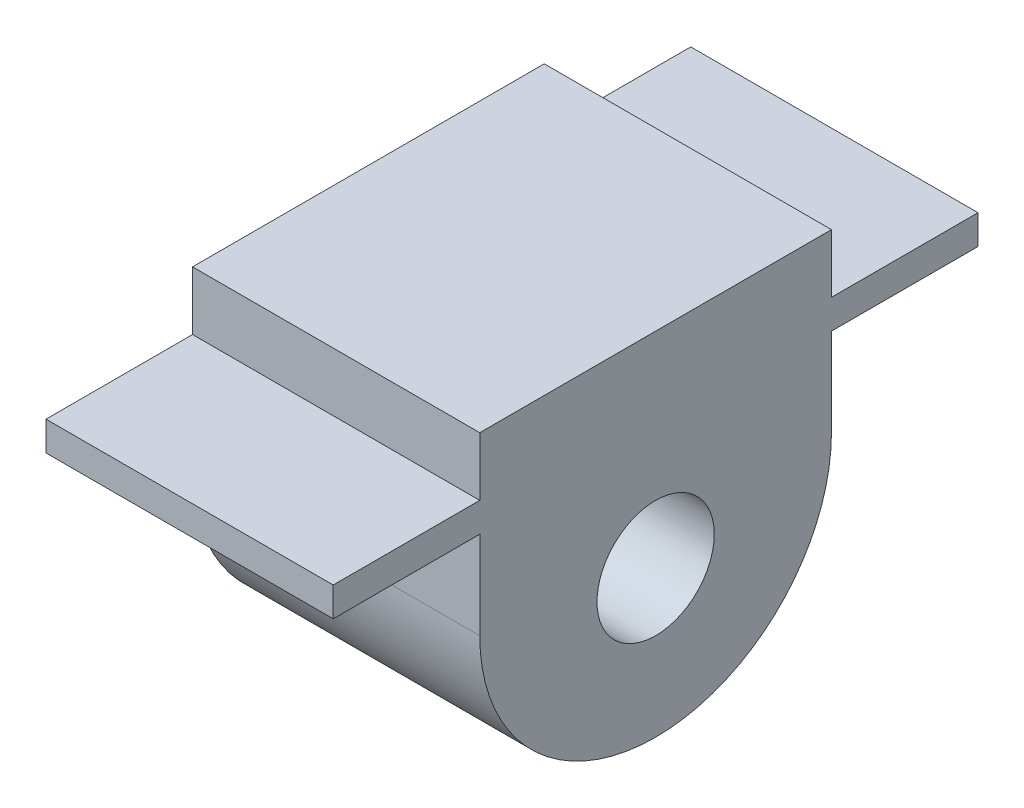
ISO-10303-21;
HEADER;
FILE_DESCRIPTION(('STEP AP214'),'2;1');
FILE_NAME('part.step','',(''),(''),'','','');
FILE_SCHEMA(('AUTOMOTIVE_DESIGN { 1 0 10303 214 1 1 1 1 }'));
ENDSEC;
DATA;
#1=APPLICATION_CONTEXT('core data for automotive mechanical design processes');
#2=APPLICATION_PROTOCOL_DEFINITION('international standard','automotive_design',2000,#1);
#3=PRODUCT_CONTEXT('',#1,'mechanical');
#4=PRODUCT('Part','Part','',(#3));
#5=PRODUCT_RELATED_PRODUCT_CATEGORY('part','',(#4));
#6=PRODUCT_DEFINITION_FORMATION('','',#4);
#7=PRODUCT_DEFINITION_CONTEXT('part definition',#1,'design');
#8=PRODUCT_DEFINITION('design','',#6,#7);
#9=PRODUCT_DEFINITION_SHAPE('','',#8);
#10=(LENGTH_UNIT() NAMED_UNIT(*) SI_UNIT(.MILLI.,.METRE.));
#11=(NAMED_UNIT(*) PLANE_ANGLE_UNIT() SI_UNIT($,.RADIAN.));
#12=(NAMED_UNIT(*) SI_UNIT($,.STERADIAN.) SOLID_ANGLE_UNIT());
#13=UNCERTAINTY_MEASURE_WITH_UNIT(LENGTH_MEASURE(1.E-05),#10,'distance_accuracy_value','');
#14=(GEOMETRIC_REPRESENTATION_CONTEXT(3) GLOBAL_UNCERTAINTY_ASSIGNED_CONTEXT((#13)) GLOBAL_UNIT_ASSIGNED_CONTEXT((#10,
#11,#12)) REPRESENTATION_CONTEXT('',''));
#15=CARTESIAN_POINT('',(0.,0.,0.));
#16=DIRECTION('',(0.,0.,1.));
#17=DIRECTION('',(1.,0.,0.));
#18=AXIS2_PLACEMENT_3D('',#15,#16,#17);
#19=CARTESIAN_POINT('',(-4.9,-10.,6.));
#20=DIRECTION('',(0.,0.,-1.));
#21=DIRECTION('',(-1.,0.,0.));
#22=AXIS2_PLACEMENT_3D('',#19,#20,#21);
#23=PLANE('',#22);
#24=DIRECTION('',(0.,1.,0.));
#25=VECTOR('',#24,1.);
#26=CARTESIAN_POINT('',(-4.9,-10.,6.));
#27=LINE('',#26,#25);
#28=CARTESIAN_POINT('',(-4.9,0.,6.));
#29=VERTEX_POINT('',#28);
#30=CARTESIAN_POINT('',(-4.9,2.,6.));
#31=VERTEX_POINT('',#30);
#32=EDGE_CURVE('E258',#29,#31,#27,.T.);
#33=ORIENTED_EDGE('',*,*,#32,.F.);
#34=DIRECTION('',(1.,0.,0.));
#35=VECTOR('',#34,1.);
#36=CARTESIAN_POINT('',(4.9,0.,6.));
#37=LINE('',#36,#35);
#38=CARTESIAN_POINT('',(4.9,0.,6.));
#39=VERTEX_POINT('',#38);
#40=EDGE_CURVE('E97',#29,#39,#37,.T.);
#41=ORIENTED_EDGE('',*,*,#40,.T.);
#42=DIRECTION('',(0.,1.,0.));
#43=VECTOR('',#42,1.);
#44=CARTESIAN_POINT('',(4.9,-10.,6.));
#45=LINE('',#44,#43);
#46=CARTESIAN_POINT('',(4.9,2.,6.));
#47=VERTEX_POINT('',#46);
#48=EDGE_CURVE('E183',#39,#47,#45,.T.);
#49=ORIENTED_EDGE('',*,*,#48,.T.);
#50=DIRECTION('',(-1.,0.,0.));
#51=VECTOR('',#50,1.);
#52=CARTESIAN_POINT('',(0.,2.,6.));
#53=LINE('',#52,#51);
#54=EDGE_CURVE('E238',#47,#31,#53,.T.);
#55=ORIENTED_EDGE('',*,*,#54,.T.);
#56=EDGE_LOOP('',(#33,#41,#49,#55));
#57=FACE_BOUND('',#56,.T.);
#58=ADVANCED_FACE('F81',(#57),#23,.F.);
#59=CARTESIAN_POINT('',(-4.9,-10.,-6.));
#60=DIRECTION('',(0.,0.,1.));
#61=DIRECTION('',(1.,0.,0.));
#62=AXIS2_PLACEMENT_3D('',#59,#60,#61);
#63=PLANE('',#62);
#64=DIRECTION('',(-1.,0.,0.));
#65=VECTOR('',#64,1.);
#66=CARTESIAN_POINT('',(-4.9,-1.,-6.));
#67=LINE('',#66,#65);
#68=CARTESIAN_POINT('',(4.9,-0.999999999999999,-6.));
#69=VERTEX_POINT('',#68);
#70=CARTESIAN_POINT('',(-4.9,-1.,-6.));
#71=VERTEX_POINT('',#70);
#72=EDGE_CURVE('E185',#69,#71,#67,.T.);
#73=ORIENTED_EDGE('',*,*,#72,.F.);
#74=DIRECTION('',(0.,1.,0.));
#75=VECTOR('',#74,1.);
#76=CARTESIAN_POINT('',(4.9,-10.,-6.));
#77=LINE('',#76,#75);
#78=CARTESIAN_POINT('',(4.9,-4.,-6.));
#79=VERTEX_POINT('',#78);
#80=EDGE_CURVE('E251',#79,#69,#77,.T.);
#81=ORIENTED_EDGE('',*,*,#80,.F.);
#82=DIRECTION('',(1.,0.,0.));
#83=VECTOR('',#82,1.);
#84=CARTESIAN_POINT('',(-4.9,-4.,-6.));
#85=LINE('',#84,#83);
#86=CARTESIAN_POINT('',(-4.9,-4.,-6.));
#87=VERTEX_POINT('',#86);
#88=EDGE_CURVE('E12',#79,#87,#85,.F.);
#89=ORIENTED_EDGE('',*,*,#88,.T.);
#90=DIRECTION('',(0.,1.,0.));
#91=VECTOR('',#90,1.);
#92=CARTESIAN_POINT('',(-4.9,-10.,-6.));
#93=LINE('',#92,#91);
#94=EDGE_CURVE('E256',#87,#71,#93,.T.);
#95=ORIENTED_EDGE('',*,*,#94,.T.);
#96=EDGE_LOOP('',(#73,#81,#89,#95));
#97=FACE_BOUND('',#96,.T.);
#98=ADVANCED_FACE('F318',(#97),#63,.F.);
#99=DIRECTION('',(1.,0.,0.));
#100=VECTOR('',#99,1.);
#101=CARTESIAN_POINT('',(4.9,0.,-6.));
#102=LINE('',#101,#100);
#103=CARTESIAN_POINT('',(-4.9,0.,-6.));
#104=VERTEX_POINT('',#103);
#105=CARTESIAN_POINT('',(4.9,0.,-6.));
#106=VERTEX_POINT('',#105);
#107=EDGE_CURVE('E105',#104,#106,#102,.T.);
#108=ORIENTED_EDGE('',*,*,#107,.F.);
#109=CARTESIAN_POINT('',(-4.9,2.,-6.));
#110=VERTEX_POINT('',#109);
#111=EDGE_CURVE('E254',#104,#110,#93,.T.);
#112=ORIENTED_EDGE('',*,*,#111,.T.);
#113=DIRECTION('',(1.,0.,0.));
#114=VECTOR('',#113,1.);
#115=CARTESIAN_POINT('',(0.,2.,-6.));
#116=LINE('',#115,#114);
#117=CARTESIAN_POINT('',(4.9,2.,-6.));
#118=VERTEX_POINT('',#117);
#119=EDGE_CURVE('E244',#110,#118,#116,.T.);
#120=ORIENTED_EDGE('',*,*,#119,.T.);
#121=EDGE_CURVE('E255',#106,#118,#77,.T.);
#122=ORIENTED_EDGE('',*,*,#121,.F.);
#123=EDGE_LOOP('',(#108,#112,#120,#122));
#124=FACE_BOUND('',#123,.T.);
#125=ADVANCED_FACE('F319',(#124),#63,.F.);
#126=CARTESIAN_POINT('',(0.,2.,0.));
#127=DIRECTION('',(0.,-1.,0.));
#128=DIRECTION('',(0.,0.,-1.));
#129=AXIS2_PLACEMENT_3D('',#126,#127,#128);
#130=PLANE('',#129);
#131=DIRECTION('',(0.,0.,-1.));
#132=VECTOR('',#131,1.);
#133=CARTESIAN_POINT('',(-4.9,2.,0.));
#134=LINE('',#133,#132);
#135=EDGE_CURVE('E241',#31,#110,#134,.T.);
#136=ORIENTED_EDGE('',*,*,#135,.F.);
#137=ORIENTED_EDGE('',*,*,#54,.F.);
#138=DIRECTION('',(0.,0.,1.));
#139=VECTOR('',#138,1.);
#140=CARTESIAN_POINT('',(4.9,2.,0.));
#141=LINE('',#140,#139);
#142=EDGE_CURVE('E236',#118,#47,#141,.T.);
#143=ORIENTED_EDGE('',*,*,#142,.F.);
#144=ORIENTED_EDGE('',*,*,#119,.F.);
#145=EDGE_LOOP('',(#136,#137,#143,#144));
#146=FACE_BOUND('',#145,.T.);
#147=ADVANCED_FACE('F303',(#146),#130,.F.);
#148=CARTESIAN_POINT('',(4.9,-10.,6.));
#149=DIRECTION('',(-1.,0.,0.));
#150=DIRECTION('',(0.,0.,1.));
#151=AXIS2_PLACEMENT_3D('',#148,#149,#150);
#152=PLANE('',#151);
#153=CARTESIAN_POINT('',(4.9,-5.,0.));
#154=DIRECTION('',(1.,0.,0.));
#155=DIRECTION('',(0.,0.,-1.));
#156=AXIS2_PLACEMENT_3D('',#153,#154,#155);
#157=CIRCLE('',#156,2.);
#158=CARTESIAN_POINT('',(4.9,-5.,-2.));
#159=VERTEX_POINT('',#158);
#160=EDGE_CURVE('E247',#159,#159,#157,.T.);
#161=ORIENTED_EDGE('',*,*,#160,.F.);
#162=EDGE_LOOP('',(#161));
#163=FACE_BOUND('',#162,.T.);
#164=CARTESIAN_POINT('',(4.9,-4.,6.));
#165=VERTEX_POINT('',#164);
#166=CARTESIAN_POINT('',(4.9,-1.,6.));
#167=VERTEX_POINT('',#166);
#168=EDGE_CURVE('E262',#165,#167,#45,.T.);
#169=ORIENTED_EDGE('',*,*,#168,.F.);
#170=CARTESIAN_POINT('',(4.9,-4.,0.));
#171=DIRECTION('',(-1.,0.,0.));
#172=DIRECTION('',(0.,0.,1.));
#173=AXIS2_PLACEMENT_3D('',#170,#171,#172);
#174=CIRCLE('',#173,6.);
#175=CARTESIAN_POINT('',(4.9,-10.,0.));
#176=VERTEX_POINT('',#175);
#177=EDGE_CURVE('E90',#165,#176,#174,.F.);
#178=ORIENTED_EDGE('',*,*,#177,.T.);
#179=CARTESIAN_POINT('',(4.9,-4.,0.));
#180=DIRECTION('',(-1.,0.,0.));
#181=DIRECTION('',(0.,0.,1.));
#182=AXIS2_PLACEMENT_3D('',#179,#180,#181);
#183=CIRCLE('',#182,6.);
#184=EDGE_CURVE('E274',#176,#79,#183,.F.);
#185=ORIENTED_EDGE('',*,*,#184,.T.);
#186=ORIENTED_EDGE('',*,*,#80,.T.);
#187=DIRECTION('',(0.,0.,1.));
#188=VECTOR('',#187,1.);
#189=CARTESIAN_POINT('',(4.9,-1.,-11.));
#190=LINE('',#189,#188);
#191=CARTESIAN_POINT('',(4.9,-1.,-11.));
#192=VERTEX_POINT('',#191);
#193=EDGE_CURVE('E233',#192,#69,#190,.T.);
#194=ORIENTED_EDGE('',*,*,#193,.F.);
#195=DIRECTION('',(0.,-1.,0.));
#196=VECTOR('',#195,1.);
#197=CARTESIAN_POINT('',(4.9,-1.,-11.));
#198=LINE('',#197,#196);
#199=CARTESIAN_POINT('',(4.9,0.,-11.));
#200=VERTEX_POINT('',#199);
#201=EDGE_CURVE('E212',#200,#192,#198,.T.);
#202=ORIENTED_EDGE('',*,*,#201,.F.);
#203=DIRECTION('',(0.,0.,1.));
#204=VECTOR('',#203,1.);
#205=CARTESIAN_POINT('',(4.9,0.,-11.));
#206=LINE('',#205,#204);
#207=EDGE_CURVE('E221',#200,#106,#206,.T.);
#208=ORIENTED_EDGE('',*,*,#207,.T.);
#209=ORIENTED_EDGE('',*,*,#121,.T.);
#210=ORIENTED_EDGE('',*,*,#142,.T.);
#211=ORIENTED_EDGE('',*,*,#48,.F.);
#212=DIRECTION('',(0.,0.,-1.));
#213=VECTOR('',#212,1.);
#214=CARTESIAN_POINT('',(4.9,0.,11.));
#215=LINE('',#214,#213);
#216=CARTESIAN_POINT('',(4.9,0.,11.));
#217=VERTEX_POINT('',#216);
#218=EDGE_CURVE('E176',#217,#39,#215,.T.);
#219=ORIENTED_EDGE('',*,*,#218,.F.);
#220=DIRECTION('',(0.,-1.,0.));
#221=VECTOR('',#220,1.);
#222=CARTESIAN_POINT('',(4.9,-1.,11.));
#223=LINE('',#222,#221);
#224=CARTESIAN_POINT('',(4.9,-1.,11.));
#225=VERTEX_POINT('',#224);
#226=EDGE_CURVE('E180',#217,#225,#223,.T.);
#227=ORIENTED_EDGE('',*,*,#226,.T.);
#228=DIRECTION('',(0.,0.,-1.));
#229=VECTOR('',#228,1.);
#230=CARTESIAN_POINT('',(4.9,-1.,11.));
#231=LINE('',#230,#229);
#232=EDGE_CURVE('E204',#225,#167,#231,.T.);
#233=ORIENTED_EDGE('',*,*,#232,.T.);
#234=EDGE_LOOP('',(#169,#178,#185,#186,#194,#202,#208,#209,#210,#211,#219,#227,#233));
#235=FACE_BOUND('',#234,.T.);
#236=ADVANCED_FACE('F179',(#163,#235),#152,.F.);
#237=ORIENTED_EDGE('',*,*,#168,.T.);
#238=DIRECTION('',(-1.,0.,0.));
#239=VECTOR('',#238,1.);
#240=CARTESIAN_POINT('',(-4.9,-1.,6.));
#241=LINE('',#240,#239);
#242=CARTESIAN_POINT('',(-4.9,-1.,6.));
#243=VERTEX_POINT('',#242);
#244=EDGE_CURVE('E196',#167,#243,#241,.T.);
#245=ORIENTED_EDGE('',*,*,#244,.T.);
#246=CARTESIAN_POINT('',(-4.9,-4.,6.));
#247=VERTEX_POINT('',#246);
#248=EDGE_CURVE('E259',#247,#243,#27,.T.);
#249=ORIENTED_EDGE('',*,*,#248,.F.);
#250=DIRECTION('',(-1.,0.,0.));
#251=VECTOR('',#250,1.);
#252=CARTESIAN_POINT('',(4.9,-4.,6.));
#253=LINE('',#252,#251);
#254=EDGE_CURVE('E271',#247,#165,#253,.F.);
#255=ORIENTED_EDGE('',*,*,#254,.T.);
#256=EDGE_LOOP('',(#237,#245,#249,#255));
#257=FACE_BOUND('',#256,.T.);
#258=ADVANCED_FACE('F292',(#257),#23,.F.);
#259=CARTESIAN_POINT('',(-4.9,-10.,6.));
#260=DIRECTION('',(1.,0.,0.));
#261=DIRECTION('',(0.,0.,-1.));
#262=AXIS2_PLACEMENT_3D('',#259,#260,#261);
#263=PLANE('',#262);
#264=CARTESIAN_POINT('',(-4.9,-5.,0.));
#265=DIRECTION('',(1.,0.,0.));
#266=DIRECTION('',(0.,0.,-1.));
#267=AXIS2_PLACEMENT_3D('',#264,#265,#266);
#268=CIRCLE('',#267,2.);
#269=CARTESIAN_POINT('',(-4.9,-5.,-2.));
#270=VERTEX_POINT('',#269);
#271=EDGE_CURVE('E250',#270,#270,#268,.T.);
#272=ORIENTED_EDGE('',*,*,#271,.T.);
#273=EDGE_LOOP('',(#272));
#274=FACE_BOUND('',#273,.T.);
#275=CARTESIAN_POINT('',(-4.9,-4.,0.));
#276=DIRECTION('',(1.,0.,0.));
#277=DIRECTION('',(0.,0.,-1.));
#278=AXIS2_PLACEMENT_3D('',#275,#276,#277);
#279=CIRCLE('',#278,6.);
#280=CARTESIAN_POINT('',(-4.9,-10.,0.));
#281=VERTEX_POINT('',#280);
#282=EDGE_CURVE('E265',#87,#281,#279,.F.);
#283=ORIENTED_EDGE('',*,*,#282,.T.);
#284=CARTESIAN_POINT('',(-4.9,-4.,0.));
#285=DIRECTION('',(1.,0.,0.));
#286=DIRECTION('',(0.,0.,-1.));
#287=AXIS2_PLACEMENT_3D('',#284,#285,#286);
#288=CIRCLE('',#287,6.);
#289=EDGE_CURVE('E269',#281,#247,#288,.F.);
#290=ORIENTED_EDGE('',*,*,#289,.T.);
#291=ORIENTED_EDGE('',*,*,#248,.T.);
#292=DIRECTION('',(0.,0.,-1.));
#293=VECTOR('',#292,1.);
#294=CARTESIAN_POINT('',(-4.9,-1.,11.));
#295=LINE('',#294,#293);
#296=CARTESIAN_POINT('',(-4.9,-1.,11.));
#297=VERTEX_POINT('',#296);
#298=EDGE_CURVE('E209',#297,#243,#295,.T.);
#299=ORIENTED_EDGE('',*,*,#298,.F.);
#300=DIRECTION('',(0.,1.,0.));
#301=VECTOR('',#300,1.);
#302=CARTESIAN_POINT('',(-4.9,0.,11.));
#303=LINE('',#302,#301);
#304=CARTESIAN_POINT('',(-4.9,0.,11.));
#305=VERTEX_POINT('',#304);
#306=EDGE_CURVE('E199',#297,#305,#303,.T.);
#307=ORIENTED_EDGE('',*,*,#306,.T.);
#308=DIRECTION('',(0.,0.,-1.));
#309=VECTOR('',#308,1.);
#310=CARTESIAN_POINT('',(-4.9,0.,11.));
#311=LINE('',#310,#309);
#312=EDGE_CURVE('E186',#305,#29,#311,.T.);
#313=ORIENTED_EDGE('',*,*,#312,.T.);
#314=ORIENTED_EDGE('',*,*,#32,.T.);
#315=ORIENTED_EDGE('',*,*,#135,.T.);
#316=ORIENTED_EDGE('',*,*,#111,.F.);
#317=DIRECTION('',(0.,0.,1.));
#318=VECTOR('',#317,1.);
#319=CARTESIAN_POINT('',(-4.9,0.,-11.));
#320=LINE('',#319,#318);
#321=CARTESIAN_POINT('',(-4.9,0.,-11.));
#322=VERTEX_POINT('',#321);
#323=EDGE_CURVE('E227',#322,#104,#320,.T.);
#324=ORIENTED_EDGE('',*,*,#323,.F.);
#325=DIRECTION('',(0.,1.,0.));
#326=VECTOR('',#325,1.);
#327=CARTESIAN_POINT('',(-4.9,0.,-11.));
#328=LINE('',#327,#326);
#329=CARTESIAN_POINT('',(-4.9,-1.,-11.));
#330=VERTEX_POINT('',#329);
#331=EDGE_CURVE('E217',#330,#322,#328,.T.);
#332=ORIENTED_EDGE('',*,*,#331,.F.);
#333=DIRECTION('',(0.,0.,1.));
#334=VECTOR('',#333,1.);
#335=CARTESIAN_POINT('',(-4.9,-1.,-11.));
#336=LINE('',#335,#334);
#337=EDGE_CURVE('E230',#330,#71,#336,.T.);
#338=ORIENTED_EDGE('',*,*,#337,.T.);
#339=ORIENTED_EDGE('',*,*,#94,.F.);
#340=EDGE_LOOP('',(#283,#290,#291,#299,#307,#313,#314,#315,#316,#324,#332,#338,#339));
#341=FACE_BOUND('',#340,.T.);
#342=ADVANCED_FACE('F289',(#274,#341),#263,.F.);
#343=CARTESIAN_POINT('',(-18.1,-5.,0.));
#344=DIRECTION('',(1.,0.,0.));
#345=DIRECTION('',(0.,0.,-1.));
#346=AXIS2_PLACEMENT_3D('',#343,#344,#345);
#347=CYLINDRICAL_SURFACE('',#346,2.);
#348=ORIENTED_EDGE('',*,*,#160,.T.);
#349=EDGE_LOOP('',(#348));
#350=FACE_BOUND('',#349,.T.);
#351=ORIENTED_EDGE('',*,*,#271,.F.);
#352=EDGE_LOOP('',(#351));
#353=FACE_BOUND('',#352,.T.);
#354=ADVANCED_FACE('F339',(#350,#353),#347,.F.);
#355=CARTESIAN_POINT('',(0.,-4.,0.));
#356=DIRECTION('',(-1.,0.,0.));
#357=DIRECTION('',(0.,0.,1.));
#358=AXIS2_PLACEMENT_3D('',#355,#356,#357);
#359=CYLINDRICAL_SURFACE('',#358,6.);
#360=ORIENTED_EDGE('',*,*,#88,.F.);
#361=ORIENTED_EDGE('',*,*,#184,.F.);
#362=DIRECTION('',(1.,0.,0.));
#363=VECTOR('',#362,1.);
#364=CARTESIAN_POINT('',(4.9,-10.,0.));
#365=LINE('',#364,#363);
#366=EDGE_CURVE('E85',#281,#176,#365,.T.);
#367=ORIENTED_EDGE('',*,*,#366,.F.);
#368=ORIENTED_EDGE('',*,*,#282,.F.);
#369=EDGE_LOOP('',(#360,#361,#367,#368));
#370=FACE_BOUND('',#369,.T.);
#371=ADVANCED_FACE('F83',(#370),#359,.T.);
#372=CARTESIAN_POINT('',(0.,-4.,0.));
#373=DIRECTION('',(1.,0.,0.));
#374=DIRECTION('',(0.,0.,-1.));
#375=AXIS2_PLACEMENT_3D('',#372,#373,#374);
#376=CYLINDRICAL_SURFACE('',#375,6.);
#377=ORIENTED_EDGE('',*,*,#177,.F.);
#378=ORIENTED_EDGE('',*,*,#254,.F.);
#379=ORIENTED_EDGE('',*,*,#289,.F.);
#380=ORIENTED_EDGE('',*,*,#366,.T.);
#381=EDGE_LOOP('',(#377,#378,#379,#380));
#382=FACE_BOUND('',#381,.T.);
#383=ADVANCED_FACE('F286',(#382),#376,.T.);
#384=CARTESIAN_POINT('',(-4.9,-1.,-11.));
#385=DIRECTION('',(0.,1.,0.));
#386=DIRECTION('',(0.,0.,1.));
#387=AXIS2_PLACEMENT_3D('',#384,#385,#386);
#388=PLANE('',#387);
#389=ORIENTED_EDGE('',*,*,#72,.T.);
#390=ORIENTED_EDGE('',*,*,#337,.F.);
#391=DIRECTION('',(-1.,0.,0.));
#392=VECTOR('',#391,1.);
#393=CARTESIAN_POINT('',(-4.9,-1.,-11.));
#394=LINE('',#393,#392);
#395=EDGE_CURVE('E215',#192,#330,#394,.T.);
#396=ORIENTED_EDGE('',*,*,#395,.F.);
#397=ORIENTED_EDGE('',*,*,#193,.T.);
#398=EDGE_LOOP('',(#389,#390,#396,#397));
#399=FACE_BOUND('',#398,.T.);
#400=ADVANCED_FACE('F316',(#399),#388,.F.);
#401=CARTESIAN_POINT('',(4.9,0.,-11.));
#402=DIRECTION('',(0.,-1.,0.));
#403=DIRECTION('',(0.,0.,-1.));
#404=AXIS2_PLACEMENT_3D('',#401,#402,#403);
#405=PLANE('',#404);
#406=ORIENTED_EDGE('',*,*,#107,.T.);
#407=ORIENTED_EDGE('',*,*,#207,.F.);
#408=DIRECTION('',(1.,0.,0.));
#409=VECTOR('',#408,1.);
#410=CARTESIAN_POINT('',(4.9,0.,-11.));
#411=LINE('',#410,#409);
#412=EDGE_CURVE('E219',#322,#200,#411,.T.);
#413=ORIENTED_EDGE('',*,*,#412,.F.);
#414=ORIENTED_EDGE('',*,*,#323,.T.);
#415=EDGE_LOOP('',(#406,#407,#413,#414));
#416=FACE_BOUND('',#415,.T.);
#417=ADVANCED_FACE('F308',(#416),#405,.F.);
#418=CARTESIAN_POINT('',(0.,0.,-11.));
#419=DIRECTION('',(0.,0.,1.));
#420=DIRECTION('',(1.,0.,0.));
#421=AXIS2_PLACEMENT_3D('',#418,#419,#420);
#422=PLANE('',#421);
#423=ORIENTED_EDGE('',*,*,#201,.T.);
#424=ORIENTED_EDGE('',*,*,#395,.T.);
#425=ORIENTED_EDGE('',*,*,#331,.T.);
#426=ORIENTED_EDGE('',*,*,#412,.T.);
#427=EDGE_LOOP('',(#423,#424,#425,#426));
#428=FACE_BOUND('',#427,.T.);
#429=ADVANCED_FACE('F312',(#428),#422,.F.);
#430=CARTESIAN_POINT('',(4.9,0.,11.));
#431=DIRECTION('',(0.,1.,0.));
#432=DIRECTION('',(0.,0.,1.));
#433=AXIS2_PLACEMENT_3D('',#430,#431,#432);
#434=PLANE('',#433);
#435=ORIENTED_EDGE('',*,*,#40,.F.);
#436=ORIENTED_EDGE('',*,*,#312,.F.);
#437=DIRECTION('',(1.,0.,0.));
#438=VECTOR('',#437,1.);
#439=CARTESIAN_POINT('',(4.9,0.,11.));
#440=LINE('',#439,#438);
#441=EDGE_CURVE('E192',#305,#217,#440,.T.);
#442=ORIENTED_EDGE('',*,*,#441,.T.);
#443=ORIENTED_EDGE('',*,*,#218,.T.);
#444=EDGE_LOOP('',(#435,#436,#442,#443));
#445=FACE_BOUND('',#444,.T.);
#446=ADVANCED_FACE('F198',(#445),#434,.T.);
#447=CARTESIAN_POINT('',(-4.9,-1.,11.));
#448=DIRECTION('',(0.,-1.,0.));
#449=DIRECTION('',(0.,0.,-1.));
#450=AXIS2_PLACEMENT_3D('',#447,#448,#449);
#451=PLANE('',#450);
#452=ORIENTED_EDGE('',*,*,#244,.F.);
#453=ORIENTED_EDGE('',*,*,#232,.F.);
#454=DIRECTION('',(-1.,0.,0.));
#455=VECTOR('',#454,1.);
#456=CARTESIAN_POINT('',(-4.9,-1.,11.));
#457=LINE('',#456,#455);
#458=EDGE_CURVE('E195',#225,#297,#457,.T.);
#459=ORIENTED_EDGE('',*,*,#458,.T.);
#460=ORIENTED_EDGE('',*,*,#298,.T.);
#461=EDGE_LOOP('',(#452,#453,#459,#460));
#462=FACE_BOUND('',#461,.T.);
#463=ADVANCED_FACE('F295',(#462),#451,.T.);
#464=CARTESIAN_POINT('',(0.,0.,11.));
#465=DIRECTION('',(0.,0.,-1.));
#466=DIRECTION('',(1.,0.,0.));
#467=AXIS2_PLACEMENT_3D('',#464,#465,#466);
#468=PLANE('',#467);
#469=ORIENTED_EDGE('',*,*,#226,.F.);
#470=ORIENTED_EDGE('',*,*,#441,.F.);
#471=ORIENTED_EDGE('',*,*,#306,.F.);
#472=ORIENTED_EDGE('',*,*,#458,.F.);
#473=EDGE_LOOP('',(#469,#470,#471,#472));
#474=FACE_BOUND('',#473,.T.);
#475=ADVANCED_FACE('F190',(#474),#468,.F.);
#476=CLOSED_SHELL('',(#58,#98,#125,#147,#236,#258,#342,#354,#371,#383,#400,#417,#429,#446,#463,#475));
#477=MANIFOLD_SOLID_BREP('B2',#476);
#478=ADVANCED_BREP_SHAPE_REPRESENTATION('',(#18,#477),#14);
#479=SHAPE_DEFINITION_REPRESENTATION(#9,#478);
ENDSEC;
END-ISO-10303-21;
